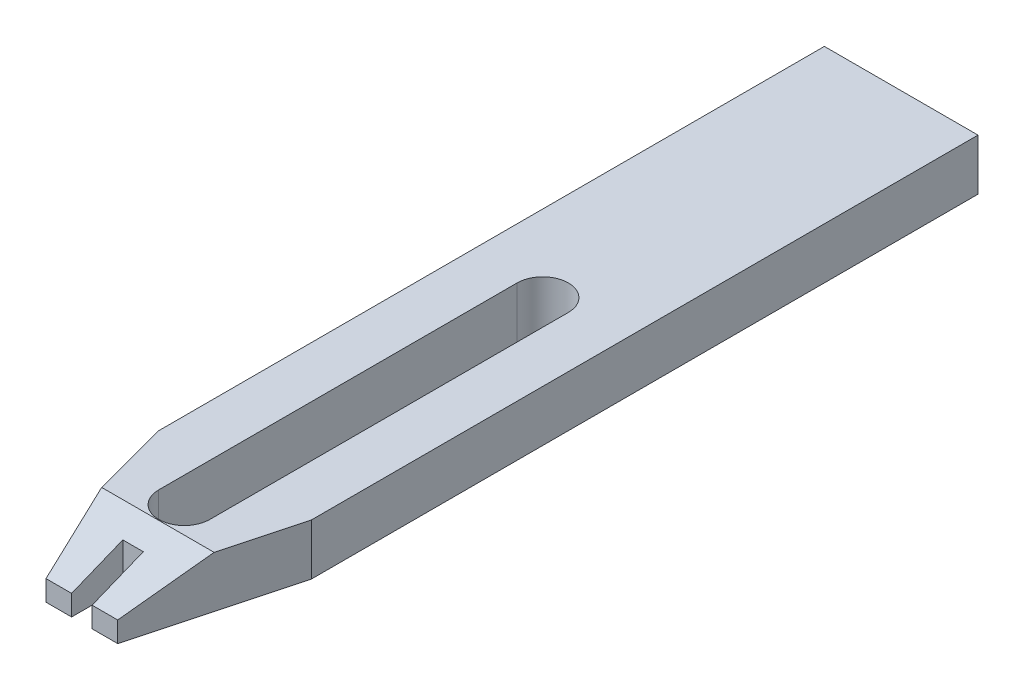
ISO-10303-21;
HEADER;
FILE_DESCRIPTION(('STEP AP214'),'2;1');
FILE_NAME('part.step','',(''),(''),'','','');
FILE_SCHEMA(('AUTOMOTIVE_DESIGN { 1 0 10303 214 1 1 1 1 }'));
ENDSEC;
DATA;
#1=APPLICATION_CONTEXT('core data for automotive mechanical design processes');
#2=APPLICATION_PROTOCOL_DEFINITION('international standard','automotive_design',2000,#1);
#3=PRODUCT_CONTEXT('',#1,'mechanical');
#4=PRODUCT('Part','Part','',(#3));
#5=PRODUCT_RELATED_PRODUCT_CATEGORY('part','',(#4));
#6=PRODUCT_DEFINITION_FORMATION('','',#4);
#7=PRODUCT_DEFINITION_CONTEXT('part definition',#1,'design');
#8=PRODUCT_DEFINITION('design','',#6,#7);
#9=PRODUCT_DEFINITION_SHAPE('','',#8);
#10=(LENGTH_UNIT() NAMED_UNIT(*) SI_UNIT(.MILLI.,.METRE.));
#11=(NAMED_UNIT(*) PLANE_ANGLE_UNIT() SI_UNIT($,.RADIAN.));
#12=(NAMED_UNIT(*) SI_UNIT($,.STERADIAN.) SOLID_ANGLE_UNIT());
#13=UNCERTAINTY_MEASURE_WITH_UNIT(LENGTH_MEASURE(1.E-05),#10,'distance_accuracy_value','');
#14=(GEOMETRIC_REPRESENTATION_CONTEXT(3) GLOBAL_UNCERTAINTY_ASSIGNED_CONTEXT((#13)) GLOBAL_UNIT_ASSIGNED_CONTEXT((#10,
#11,#12)) REPRESENTATION_CONTEXT('',''));
#15=CARTESIAN_POINT('',(0.,0.,0.));
#16=DIRECTION('',(0.,0.,1.));
#17=DIRECTION('',(1.,0.,0.));
#18=AXIS2_PLACEMENT_3D('',#15,#16,#17);
#19=CARTESIAN_POINT('',(7.50000000000001,5.,40.));
#20=DIRECTION('',(0.,-1.,0.));
#21=DIRECTION('',(0.,0.,-1.));
#22=AXIS2_PLACEMENT_3D('',#19,#20,#21);
#23=PLANE('',#22);
#24=DIRECTION('',(-0.258819045102521,0.,-0.965925826289068));
#25=VECTOR('',#24,1.);
#26=CARTESIAN_POINT('',(-3.49999999999999,5.,40.));
#27=LINE('',#26,#25);
#28=CARTESIAN_POINT('',(-7.50000000000001,5.,25.0717967697244));
#29=VERTEX_POINT('',#28);
#30=CARTESIAN_POINT('',(-5.48959257070934,5.,32.5747394397512));
#31=VERTEX_POINT('',#30);
#32=EDGE_CURVE('E232',#29,#31,#27,.F.);
#33=ORIENTED_EDGE('',*,*,#32,.T.);
#34=DIRECTION('',(1.,0.,0.));
#35=VECTOR('',#34,1.);
#36=CARTESIAN_POINT('',(7.50000000000001,5.,32.5747394397512));
#37=LINE('',#36,#35);
#38=CARTESIAN_POINT('',(5.48959257070935,5.,32.5747394397512));
#39=VERTEX_POINT('',#38);
#40=EDGE_CURVE('E240',#31,#39,#37,.T.);
#41=ORIENTED_EDGE('',*,*,#40,.T.);
#42=DIRECTION('',(-0.258819045102521,0.,0.965925826289068));
#43=VECTOR('',#42,1.);
#44=CARTESIAN_POINT('',(7.5,5.,25.0717967697245));
#45=LINE('',#44,#43);
#46=CARTESIAN_POINT('',(7.50000000000002,5.,25.0717967697244));
#47=VERTEX_POINT('',#46);
#48=EDGE_CURVE('E230',#39,#47,#45,.F.);
#49=ORIENTED_EDGE('',*,*,#48,.T.);
#50=DIRECTION('',(0.,0.,-1.));
#51=VECTOR('',#50,1.);
#52=CARTESIAN_POINT('',(7.5,5.,-40.));
#53=LINE('',#52,#51);
#54=CARTESIAN_POINT('',(7.5,5.,-40.));
#55=VERTEX_POINT('',#54);
#56=EDGE_CURVE('E180',#47,#55,#53,.T.);
#57=ORIENTED_EDGE('',*,*,#56,.T.);
#58=DIRECTION('',(-1.,0.,0.));
#59=VECTOR('',#58,1.);
#60=CARTESIAN_POINT('',(-7.5,5.,-40.));
#61=LINE('',#60,#59);
#62=CARTESIAN_POINT('',(-7.5,5.,-40.));
#63=VERTEX_POINT('',#62);
#64=EDGE_CURVE('E182',#55,#63,#61,.T.);
#65=ORIENTED_EDGE('',*,*,#64,.T.);
#66=DIRECTION('',(0.,0.,1.));
#67=VECTOR('',#66,1.);
#68=CARTESIAN_POINT('',(-7.5,5.,-40.));
#69=LINE('',#68,#67);
#70=EDGE_CURVE('E185',#63,#29,#69,.T.);
#71=ORIENTED_EDGE('',*,*,#70,.T.);
#72=EDGE_LOOP('',(#33,#41,#49,#57,#65,#71));
#73=FACE_BOUND('',#72,.T.);
#74=CARTESIAN_POINT('',(0.,5.,30.));
#75=DIRECTION('',(0.,1.,0.));
#76=DIRECTION('',(0.,0.,1.));
#77=AXIS2_PLACEMENT_3D('',#74,#75,#76);
#78=CIRCLE('',#77,2.5);
#79=CARTESIAN_POINT('',(-2.5,5.,30.));
#80=VERTEX_POINT('',#79);
#81=CARTESIAN_POINT('',(2.5,5.,30.));
#82=VERTEX_POINT('',#81);
#83=EDGE_CURVE('E139',#80,#82,#78,.T.);
#84=ORIENTED_EDGE('',*,*,#83,.F.);
#85=DIRECTION('',(0.,0.,1.));
#86=VECTOR('',#85,1.);
#87=CARTESIAN_POINT('',(-2.5,5.,30.));
#88=LINE('',#87,#86);
#89=CARTESIAN_POINT('',(-2.5,5.,-5.));
#90=VERTEX_POINT('',#89);
#91=EDGE_CURVE('E164',#90,#80,#88,.T.);
#92=ORIENTED_EDGE('',*,*,#91,.F.);
#93=CARTESIAN_POINT('',(0.,5.,-5.));
#94=DIRECTION('',(0.,1.,0.));
#95=DIRECTION('',(0.,0.,1.));
#96=AXIS2_PLACEMENT_3D('',#93,#94,#95);
#97=CIRCLE('',#96,2.5);
#98=CARTESIAN_POINT('',(2.5,5.,-5.));
#99=VERTEX_POINT('',#98);
#100=EDGE_CURVE('E162',#99,#90,#97,.T.);
#101=ORIENTED_EDGE('',*,*,#100,.F.);
#102=DIRECTION('',(0.,0.,-1.));
#103=VECTOR('',#102,1.);
#104=CARTESIAN_POINT('',(2.5,5.,30.));
#105=LINE('',#104,#103);
#106=EDGE_CURVE('E149',#82,#99,#105,.T.);
#107=ORIENTED_EDGE('',*,*,#106,.F.);
#108=EDGE_LOOP('',(#84,#92,#101,#107));
#109=FACE_BOUND('',#108,.T.);
#110=ADVANCED_FACE('F31',(#73,#109),#23,.F.);
#111=CARTESIAN_POINT('',(7.50000000000001,0.,40.));
#112=DIRECTION('',(0.,-1.,0.));
#113=DIRECTION('',(0.,0.,-1.));
#114=AXIS2_PLACEMENT_3D('',#111,#112,#113);
#115=PLANE('',#114);
#116=DIRECTION('',(1.,0.,0.));
#117=VECTOR('',#116,1.);
#118=CARTESIAN_POINT('',(-0.999999999999995,0.,40.));
#119=LINE('',#118,#117);
#120=CARTESIAN_POINT('',(-3.49999999999999,0.,40.));
#121=VERTEX_POINT('',#120);
#122=CARTESIAN_POINT('',(-0.999999999999995,0.,40.));
#123=VERTEX_POINT('',#122);
#124=EDGE_CURVE('E198',#121,#123,#119,.T.);
#125=ORIENTED_EDGE('',*,*,#124,.F.);
#126=DIRECTION('',(0.258819045102521,0.,0.965925826289068));
#127=VECTOR('',#126,1.);
#128=CARTESIAN_POINT('',(-2.7631397208144,0.,42.75));
#129=LINE('',#128,#127);
#130=CARTESIAN_POINT('',(-7.5,0.,25.0717967697245));
#131=VERTEX_POINT('',#130);
#132=EDGE_CURVE('E226',#121,#131,#129,.F.);
#133=ORIENTED_EDGE('',*,*,#132,.T.);
#134=DIRECTION('',(0.,0.,1.));
#135=VECTOR('',#134,1.);
#136=CARTESIAN_POINT('',(-7.5,0.,-40.));
#137=LINE('',#136,#135);
#138=CARTESIAN_POINT('',(-7.5,0.,-40.));
#139=VERTEX_POINT('',#138);
#140=EDGE_CURVE('E195',#139,#131,#137,.T.);
#141=ORIENTED_EDGE('',*,*,#140,.F.);
#142=DIRECTION('',(-1.,0.,0.));
#143=VECTOR('',#142,1.);
#144=CARTESIAN_POINT('',(-7.5,0.,-40.));
#145=LINE('',#144,#143);
#146=CARTESIAN_POINT('',(7.5,0.,-40.));
#147=VERTEX_POINT('',#146);
#148=EDGE_CURVE('E193',#147,#139,#145,.T.);
#149=ORIENTED_EDGE('',*,*,#148,.F.);
#150=DIRECTION('',(0.,0.,-1.));
#151=VECTOR('',#150,1.);
#152=CARTESIAN_POINT('',(7.5,0.,-40.));
#153=LINE('',#152,#151);
#154=CARTESIAN_POINT('',(7.50000000000001,0.,25.0717967697245));
#155=VERTEX_POINT('',#154);
#156=EDGE_CURVE('E191',#155,#147,#153,.T.);
#157=ORIENTED_EDGE('',*,*,#156,.F.);
#158=DIRECTION('',(0.258819045102521,0.,-0.965925826289068));
#159=VECTOR('',#158,1.);
#160=CARTESIAN_POINT('',(3.76794919243112,0.,39.));
#161=LINE('',#160,#159);
#162=CARTESIAN_POINT('',(3.5,0.,40.));
#163=VERTEX_POINT('',#162);
#164=EDGE_CURVE('E224',#155,#163,#161,.F.);
#165=ORIENTED_EDGE('',*,*,#164,.T.);
#166=DIRECTION('',(1.,0.,0.));
#167=VECTOR('',#166,1.);
#168=CARTESIAN_POINT('',(1.00000000000001,0.,40.));
#169=LINE('',#168,#167);
#170=CARTESIAN_POINT('',(1.00000000000001,0.,40.));
#171=VERTEX_POINT('',#170);
#172=EDGE_CURVE('E157',#171,#163,#169,.T.);
#173=ORIENTED_EDGE('',*,*,#172,.F.);
#174=DIRECTION('',(0.,0.,1.));
#175=VECTOR('',#174,1.);
#176=CARTESIAN_POINT('',(1.,0.,35.));
#177=LINE('',#176,#175);
#178=CARTESIAN_POINT('',(1.,0.,35.));
#179=VERTEX_POINT('',#178);
#180=EDGE_CURVE('E183',#179,#171,#177,.T.);
#181=ORIENTED_EDGE('',*,*,#180,.F.);
#182=DIRECTION('',(1.,0.,0.));
#183=VECTOR('',#182,1.);
#184=CARTESIAN_POINT('',(-0.999999999999996,0.,35.));
#185=LINE('',#184,#183);
#186=CARTESIAN_POINT('',(-0.999999999999996,0.,35.));
#187=VERTEX_POINT('',#186);
#188=EDGE_CURVE('E204',#187,#179,#185,.T.);
#189=ORIENTED_EDGE('',*,*,#188,.F.);
#190=DIRECTION('',(0.,0.,-1.));
#191=VECTOR('',#190,1.);
#192=CARTESIAN_POINT('',(-0.999999999999995,0.,40.));
#193=LINE('',#192,#191);
#194=EDGE_CURVE('E201',#123,#187,#193,.T.);
#195=ORIENTED_EDGE('',*,*,#194,.F.);
#196=EDGE_LOOP('',(#125,#133,#141,#149,#157,#165,#173,#181,#189,#195));
#197=FACE_BOUND('',#196,.T.);
#198=DIRECTION('',(0.,0.,1.));
#199=VECTOR('',#198,1.);
#200=CARTESIAN_POINT('',(-2.5,0.,30.));
#201=LINE('',#200,#199);
#202=CARTESIAN_POINT('',(-2.5,0.,-5.));
#203=VERTEX_POINT('',#202);
#204=CARTESIAN_POINT('',(-2.5,0.,30.));
#205=VERTEX_POINT('',#204);
#206=EDGE_CURVE('E150',#203,#205,#201,.T.);
#207=ORIENTED_EDGE('',*,*,#206,.T.);
#208=CARTESIAN_POINT('',(0.,0.,30.));
#209=DIRECTION('',(0.,1.,0.));
#210=DIRECTION('',(0.,0.,1.));
#211=AXIS2_PLACEMENT_3D('',#208,#209,#210);
#212=CIRCLE('',#211,2.5);
#213=CARTESIAN_POINT('',(2.5,0.,30.));
#214=VERTEX_POINT('',#213);
#215=EDGE_CURVE('E168',#205,#214,#212,.T.);
#216=ORIENTED_EDGE('',*,*,#215,.T.);
#217=DIRECTION('',(0.,0.,-1.));
#218=VECTOR('',#217,1.);
#219=CARTESIAN_POINT('',(2.5,0.,30.));
#220=LINE('',#219,#218);
#221=CARTESIAN_POINT('',(2.5,0.,-5.));
#222=VERTEX_POINT('',#221);
#223=EDGE_CURVE('E156',#214,#222,#220,.T.);
#224=ORIENTED_EDGE('',*,*,#223,.T.);
#225=CARTESIAN_POINT('',(0.,0.,-5.));
#226=DIRECTION('',(0.,1.,0.));
#227=DIRECTION('',(0.,0.,1.));
#228=AXIS2_PLACEMENT_3D('',#225,#226,#227);
#229=CIRCLE('',#228,2.5);
#230=EDGE_CURVE('E171',#222,#203,#229,.T.);
#231=ORIENTED_EDGE('',*,*,#230,.T.);
#232=EDGE_LOOP('',(#207,#216,#224,#231));
#233=FACE_BOUND('',#232,.T.);
#234=ADVANCED_FACE('F270',(#197,#233),#115,.T.);
#235=CARTESIAN_POINT('',(1.00000000000001,5.,40.));
#236=DIRECTION('',(0.,0.,-1.));
#237=DIRECTION('',(-1.,0.,0.));
#238=AXIS2_PLACEMENT_3D('',#235,#236,#237);
#239=PLANE('',#238);
#240=DIRECTION('',(0.,1.,0.));
#241=VECTOR('',#240,1.);
#242=CARTESIAN_POINT('',(3.5,5.,40.));
#243=LINE('',#242,#241);
#244=CARTESIAN_POINT('',(3.5,2.,40.));
#245=VERTEX_POINT('',#244);
#246=EDGE_CURVE('E238',#163,#245,#243,.T.);
#247=ORIENTED_EDGE('',*,*,#246,.T.);
#248=DIRECTION('',(-1.,0.,0.));
#249=VECTOR('',#248,1.);
#250=CARTESIAN_POINT('',(1.00000000000001,2.,40.));
#251=LINE('',#250,#249);
#252=CARTESIAN_POINT('',(1.00000000000001,2.,40.));
#253=VERTEX_POINT('',#252);
#254=EDGE_CURVE('E39',#245,#253,#251,.T.);
#255=ORIENTED_EDGE('',*,*,#254,.T.);
#256=DIRECTION('',(0.,-1.,0.));
#257=VECTOR('',#256,1.);
#258=CARTESIAN_POINT('',(1.00000000000001,5.,40.));
#259=LINE('',#258,#257);
#260=EDGE_CURVE('E188',#253,#171,#259,.T.);
#261=ORIENTED_EDGE('',*,*,#260,.T.);
#262=ORIENTED_EDGE('',*,*,#172,.T.);
#263=EDGE_LOOP('',(#247,#255,#261,#262));
#264=FACE_BOUND('',#263,.T.);
#265=ADVANCED_FACE('F289',(#264),#239,.F.);
#266=CARTESIAN_POINT('',(7.5,5.,-40.));
#267=DIRECTION('',(-1.,0.,0.));
#268=DIRECTION('',(0.,0.,1.));
#269=AXIS2_PLACEMENT_3D('',#266,#267,#268);
#270=PLANE('',#269);
#271=ORIENTED_EDGE('',*,*,#56,.F.);
#272=DIRECTION('',(0.,-1.,0.));
#273=VECTOR('',#272,1.);
#274=CARTESIAN_POINT('',(7.5,5.,25.0717967697245));
#275=LINE('',#274,#273);
#276=EDGE_CURVE('E235',#47,#155,#275,.T.);
#277=ORIENTED_EDGE('',*,*,#276,.T.);
#278=ORIENTED_EDGE('',*,*,#156,.T.);
#279=DIRECTION('',(0.,-1.,0.));
#280=VECTOR('',#279,1.);
#281=CARTESIAN_POINT('',(7.5,5.,-40.));
#282=LINE('',#281,#280);
#283=EDGE_CURVE('E219',#55,#147,#282,.T.);
#284=ORIENTED_EDGE('',*,*,#283,.F.);
#285=EDGE_LOOP('',(#271,#277,#278,#284));
#286=FACE_BOUND('',#285,.T.);
#287=ADVANCED_FACE('F295',(#286),#270,.F.);
#288=CARTESIAN_POINT('',(-7.5,5.,-40.));
#289=DIRECTION('',(0.,0.,1.));
#290=DIRECTION('',(1.,0.,0.));
#291=AXIS2_PLACEMENT_3D('',#288,#289,#290);
#292=PLANE('',#291);
#293=ORIENTED_EDGE('',*,*,#148,.T.);
#294=DIRECTION('',(0.,-1.,0.));
#295=VECTOR('',#294,1.);
#296=CARTESIAN_POINT('',(-7.5,5.,-40.));
#297=LINE('',#296,#295);
#298=EDGE_CURVE('E216',#63,#139,#297,.T.);
#299=ORIENTED_EDGE('',*,*,#298,.F.);
#300=ORIENTED_EDGE('',*,*,#64,.F.);
#301=ORIENTED_EDGE('',*,*,#283,.T.);
#302=EDGE_LOOP('',(#293,#299,#300,#301));
#303=FACE_BOUND('',#302,.T.);
#304=ADVANCED_FACE('F299',(#303),#292,.F.);
#305=CARTESIAN_POINT('',(-7.5,5.,-40.));
#306=DIRECTION('',(1.,0.,0.));
#307=DIRECTION('',(0.,0.,-1.));
#308=AXIS2_PLACEMENT_3D('',#305,#306,#307);
#309=PLANE('',#308);
#310=ORIENTED_EDGE('',*,*,#140,.T.);
#311=DIRECTION('',(0.,1.,0.));
#312=VECTOR('',#311,1.);
#313=CARTESIAN_POINT('',(-7.5,5.,25.0717967697245));
#314=LINE('',#313,#312);
#315=EDGE_CURVE('E228',#131,#29,#314,.T.);
#316=ORIENTED_EDGE('',*,*,#315,.T.);
#317=ORIENTED_EDGE('',*,*,#70,.F.);
#318=ORIENTED_EDGE('',*,*,#298,.T.);
#319=EDGE_LOOP('',(#310,#316,#317,#318));
#320=FACE_BOUND('',#319,.T.);
#321=ADVANCED_FACE('F265',(#320),#309,.F.);
#322=CARTESIAN_POINT('',(-0.999999999999995,5.,40.));
#323=DIRECTION('',(0.,0.,-1.));
#324=DIRECTION('',(-1.,0.,0.));
#325=AXIS2_PLACEMENT_3D('',#322,#323,#324);
#326=PLANE('',#325);
#327=DIRECTION('',(0.,-1.,0.));
#328=VECTOR('',#327,1.);
#329=CARTESIAN_POINT('',(-0.999999999999995,5.,40.));
#330=LINE('',#329,#328);
#331=CARTESIAN_POINT('',(-0.999999999999995,2.,40.));
#332=VERTEX_POINT('',#331);
#333=EDGE_CURVE('E214',#332,#123,#330,.T.);
#334=ORIENTED_EDGE('',*,*,#333,.F.);
#335=DIRECTION('',(-1.,0.,0.));
#336=VECTOR('',#335,1.);
#337=CARTESIAN_POINT('',(-0.999999999999995,2.,40.));
#338=LINE('',#337,#336);
#339=CARTESIAN_POINT('',(-3.49999999999999,2.,40.));
#340=VERTEX_POINT('',#339);
#341=EDGE_CURVE('E246',#332,#340,#338,.T.);
#342=ORIENTED_EDGE('',*,*,#341,.T.);
#343=DIRECTION('',(0.,-1.,0.));
#344=VECTOR('',#343,1.);
#345=CARTESIAN_POINT('',(-3.49999999999999,5.,40.));
#346=LINE('',#345,#344);
#347=EDGE_CURVE('E222',#340,#121,#346,.T.);
#348=ORIENTED_EDGE('',*,*,#347,.T.);
#349=ORIENTED_EDGE('',*,*,#124,.T.);
#350=EDGE_LOOP('',(#334,#342,#348,#349));
#351=FACE_BOUND('',#350,.T.);
#352=ADVANCED_FACE('F275',(#351),#326,.F.);
#353=CARTESIAN_POINT('',(-0.999999999999995,5.,40.));
#354=DIRECTION('',(-1.,0.,0.));
#355=DIRECTION('',(0.,0.,1.));
#356=AXIS2_PLACEMENT_3D('',#353,#354,#355);
#357=PLANE('',#356);
#358=DIRECTION('',(0.,-1.,0.));
#359=VECTOR('',#358,1.);
#360=CARTESIAN_POINT('',(-0.999999999999996,5.,35.));
#361=LINE('',#360,#359);
#362=CARTESIAN_POINT('',(-0.999999999999995,4.02013112917579,35.));
#363=VERTEX_POINT('',#362);
#364=EDGE_CURVE('E212',#363,#187,#361,.T.);
#365=ORIENTED_EDGE('',*,*,#364,.F.);
#366=DIRECTION('',(0.,0.374606593415914,-0.927183854566787));
#367=VECTOR('',#366,1.);
#368=CARTESIAN_POINT('',(-0.999999999999995,5.,32.5747394397512));
#369=LINE('',#368,#367);
#370=EDGE_CURVE('E244',#363,#332,#369,.F.);
#371=ORIENTED_EDGE('',*,*,#370,.T.);
#372=ORIENTED_EDGE('',*,*,#333,.T.);
#373=ORIENTED_EDGE('',*,*,#194,.T.);
#374=EDGE_LOOP('',(#365,#371,#372,#373));
#375=FACE_BOUND('',#374,.T.);
#376=ADVANCED_FACE('F281',(#375),#357,.F.);
#377=CARTESIAN_POINT('',(-0.999999999999996,5.,35.));
#378=DIRECTION('',(0.,0.,-1.));
#379=DIRECTION('',(-1.,0.,0.));
#380=AXIS2_PLACEMENT_3D('',#377,#378,#379);
#381=PLANE('',#380);
#382=DIRECTION('',(1.,0.,0.));
#383=VECTOR('',#382,1.);
#384=CARTESIAN_POINT('',(7.50000000000001,4.02013112917579,35.));
#385=LINE('',#384,#383);
#386=CARTESIAN_POINT('',(1.,4.02013112917579,35.));
#387=VERTEX_POINT('',#386);
#388=EDGE_CURVE('E242',#387,#363,#385,.F.);
#389=ORIENTED_EDGE('',*,*,#388,.T.);
#390=ORIENTED_EDGE('',*,*,#364,.T.);
#391=ORIENTED_EDGE('',*,*,#188,.T.);
#392=DIRECTION('',(0.,-1.,0.));
#393=VECTOR('',#392,1.);
#394=CARTESIAN_POINT('',(1.,5.,35.));
#395=LINE('',#394,#393);
#396=EDGE_CURVE('E210',#387,#179,#395,.T.);
#397=ORIENTED_EDGE('',*,*,#396,.F.);
#398=EDGE_LOOP('',(#389,#390,#391,#397));
#399=FACE_BOUND('',#398,.T.);
#400=ADVANCED_FACE('F283',(#399),#381,.F.);
#401=CARTESIAN_POINT('',(1.,5.,35.));
#402=DIRECTION('',(1.,0.,0.));
#403=DIRECTION('',(0.,0.,-1.));
#404=AXIS2_PLACEMENT_3D('',#401,#402,#403);
#405=PLANE('',#404);
#406=ORIENTED_EDGE('',*,*,#260,.F.);
#407=DIRECTION('',(0.,-0.374606593415914,0.927183854566787));
#408=VECTOR('',#407,1.);
#409=CARTESIAN_POINT('',(1.,5.,32.5747394397512));
#410=LINE('',#409,#408);
#411=EDGE_CURVE('E11',#253,#387,#410,.F.);
#412=ORIENTED_EDGE('',*,*,#411,.T.);
#413=ORIENTED_EDGE('',*,*,#396,.T.);
#414=ORIENTED_EDGE('',*,*,#180,.T.);
#415=EDGE_LOOP('',(#406,#412,#413,#414));
#416=FACE_BOUND('',#415,.T.);
#417=ADVANCED_FACE('F287',(#416),#405,.F.);
#418=CARTESIAN_POINT('',(0.,5.,30.));
#419=DIRECTION('',(0.,-1.,0.));
#420=DIRECTION('',(0.,0.,-1.));
#421=AXIS2_PLACEMENT_3D('',#418,#419,#420);
#422=CYLINDRICAL_SURFACE('',#421,2.5);
#423=ORIENTED_EDGE('',*,*,#215,.F.);
#424=DIRECTION('',(0.,-1.,0.));
#425=VECTOR('',#424,1.);
#426=CARTESIAN_POINT('',(-2.5,5.,30.));
#427=LINE('',#426,#425);
#428=EDGE_CURVE('E145',#80,#205,#427,.T.);
#429=ORIENTED_EDGE('',*,*,#428,.F.);
#430=ORIENTED_EDGE('',*,*,#83,.T.);
#431=DIRECTION('',(0.,-1.,0.));
#432=VECTOR('',#431,1.);
#433=CARTESIAN_POINT('',(2.5,5.,30.));
#434=LINE('',#433,#432);
#435=EDGE_CURVE('E142',#82,#214,#434,.T.);
#436=ORIENTED_EDGE('',*,*,#435,.T.);
#437=EDGE_LOOP('',(#423,#429,#430,#436));
#438=FACE_BOUND('',#437,.T.);
#439=ADVANCED_FACE('F141',(#438),#422,.F.);
#440=CARTESIAN_POINT('',(2.5,5.,30.));
#441=DIRECTION('',(-1.,0.,0.));
#442=DIRECTION('',(0.,0.,1.));
#443=AXIS2_PLACEMENT_3D('',#440,#441,#442);
#444=PLANE('',#443);
#445=ORIENTED_EDGE('',*,*,#223,.F.);
#446=ORIENTED_EDGE('',*,*,#435,.F.);
#447=ORIENTED_EDGE('',*,*,#106,.T.);
#448=DIRECTION('',(0.,-1.,0.));
#449=VECTOR('',#448,1.);
#450=CARTESIAN_POINT('',(2.5,5.,-5.));
#451=LINE('',#450,#449);
#452=EDGE_CURVE('E158',#99,#222,#451,.T.);
#453=ORIENTED_EDGE('',*,*,#452,.T.);
#454=EDGE_LOOP('',(#445,#446,#447,#453));
#455=FACE_BOUND('',#454,.T.);
#456=ADVANCED_FACE('F153',(#455),#444,.T.);
#457=CARTESIAN_POINT('',(0.,5.,-5.));
#458=DIRECTION('',(0.,-1.,0.));
#459=DIRECTION('',(0.,0.,-1.));
#460=AXIS2_PLACEMENT_3D('',#457,#458,#459);
#461=CYLINDRICAL_SURFACE('',#460,2.5);
#462=ORIENTED_EDGE('',*,*,#230,.F.);
#463=ORIENTED_EDGE('',*,*,#452,.F.);
#464=ORIENTED_EDGE('',*,*,#100,.T.);
#465=DIRECTION('',(0.,-1.,0.));
#466=VECTOR('',#465,1.);
#467=CARTESIAN_POINT('',(-2.5,5.,-5.));
#468=LINE('',#467,#466);
#469=EDGE_CURVE('E177',#90,#203,#468,.T.);
#470=ORIENTED_EDGE('',*,*,#469,.T.);
#471=EDGE_LOOP('',(#462,#463,#464,#470));
#472=FACE_BOUND('',#471,.T.);
#473=ADVANCED_FACE('F353',(#472),#461,.F.);
#474=CARTESIAN_POINT('',(-2.5,5.,30.));
#475=DIRECTION('',(1.,0.,0.));
#476=DIRECTION('',(0.,0.,-1.));
#477=AXIS2_PLACEMENT_3D('',#474,#475,#476);
#478=PLANE('',#477);
#479=ORIENTED_EDGE('',*,*,#206,.F.);
#480=ORIENTED_EDGE('',*,*,#469,.F.);
#481=ORIENTED_EDGE('',*,*,#91,.T.);
#482=ORIENTED_EDGE('',*,*,#428,.T.);
#483=EDGE_LOOP('',(#479,#480,#481,#482));
#484=FACE_BOUND('',#483,.T.);
#485=ADVANCED_FACE('F359',(#484),#478,.T.);
#486=CARTESIAN_POINT('',(-3.49999999999999,5.,40.));
#487=DIRECTION('',(0.965925826289068,0.,-0.258819045102521));
#488=DIRECTION('',(-0.258819045102521,0.,-0.965925826289068));
#489=AXIS2_PLACEMENT_3D('',#486,#487,#488);
#490=PLANE('',#489);
#491=ORIENTED_EDGE('',*,*,#347,.F.);
#492=DIRECTION('',(-0.241108767199682,0.363554987210853,-0.899830169339507));
#493=VECTOR('',#492,1.);
#494=CARTESIAN_POINT('',(-3.76296888432711,2.39651668617765,39.0185867628815));
#495=LINE('',#494,#493);
#496=EDGE_CURVE('E248',#340,#31,#495,.T.);
#497=ORIENTED_EDGE('',*,*,#496,.T.);
#498=ORIENTED_EDGE('',*,*,#32,.F.);
#499=ORIENTED_EDGE('',*,*,#315,.F.);
#500=ORIENTED_EDGE('',*,*,#132,.F.);
#501=EDGE_LOOP('',(#491,#497,#498,#499,#500));
#502=FACE_BOUND('',#501,.T.);
#503=ADVANCED_FACE('F255',(#502),#490,.F.);
#504=CARTESIAN_POINT('',(7.5,5.,25.0717967697245));
#505=DIRECTION('',(-0.965925826289068,0.,-0.258819045102521));
#506=DIRECTION('',(-0.258819045102521,0.,0.965925826289068));
#507=AXIS2_PLACEMENT_3D('',#504,#505,#506);
#508=PLANE('',#507);
#509=ORIENTED_EDGE('',*,*,#48,.F.);
#510=DIRECTION('',(-0.241108767199682,-0.363554987210853,0.899830169339507));
#511=VECTOR('',#510,1.);
#512=CARTESIAN_POINT('',(7.23427996942358,7.63072061747628,26.0634774244245));
#513=LINE('',#512,#511);
#514=EDGE_CURVE('E53',#39,#245,#513,.T.);
#515=ORIENTED_EDGE('',*,*,#514,.T.);
#516=ORIENTED_EDGE('',*,*,#246,.F.);
#517=ORIENTED_EDGE('',*,*,#164,.F.);
#518=ORIENTED_EDGE('',*,*,#276,.F.);
#519=EDGE_LOOP('',(#509,#515,#516,#517,#518));
#520=FACE_BOUND('',#519,.T.);
#521=ADVANCED_FACE('F290',(#520),#508,.F.);
#522=CARTESIAN_POINT('',(7.50000000000001,5.,32.5747394397512));
#523=DIRECTION('',(0.,-0.927183854566787,-0.374606593415914));
#524=DIRECTION('',(0.,0.374606593415914,-0.927183854566787));
#525=AXIS2_PLACEMENT_3D('',#522,#523,#524);
#526=PLANE('',#525);
#527=ORIENTED_EDGE('',*,*,#514,.F.);
#528=ORIENTED_EDGE('',*,*,#40,.F.);
#529=ORIENTED_EDGE('',*,*,#496,.F.);
#530=ORIENTED_EDGE('',*,*,#341,.F.);
#531=ORIENTED_EDGE('',*,*,#370,.F.);
#532=ORIENTED_EDGE('',*,*,#388,.F.);
#533=ORIENTED_EDGE('',*,*,#411,.F.);
#534=ORIENTED_EDGE('',*,*,#254,.F.);
#535=EDGE_LOOP('',(#527,#528,#529,#530,#531,#532,#533,#534));
#536=FACE_BOUND('',#535,.T.);
#537=ADVANCED_FACE('F33',(#536),#526,.F.);
#538=CLOSED_SHELL('',(#110,#234,#265,#287,#304,#321,#352,#376,#400,#417,#439,#456,#473,#485,
#503,#521,#537));
#539=MANIFOLD_SOLID_BREP('B2',#538);
#540=ADVANCED_BREP_SHAPE_REPRESENTATION('',(#18,#539),#14);
#541=SHAPE_DEFINITION_REPRESENTATION(#9,#540);
ENDSEC;
END-ISO-10303-21;
